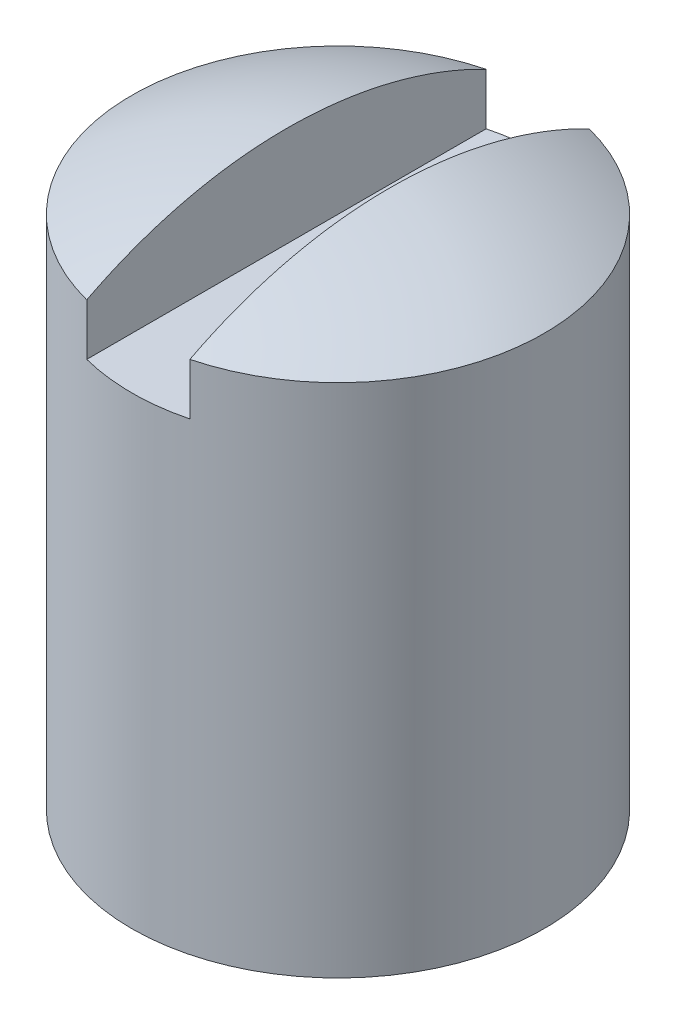
ISO-10303-21;
HEADER;
FILE_DESCRIPTION(('STEP AP214'),'2;1');
FILE_NAME('part.step','',(''),(''),'','','');
FILE_SCHEMA(('AUTOMOTIVE_DESIGN { 1 0 10303 214 1 1 1 1 }'));
ENDSEC;
DATA;
#1=APPLICATION_CONTEXT('core data for automotive mechanical design processes');
#2=APPLICATION_PROTOCOL_DEFINITION('international standard','automotive_design',2000,#1);
#3=PRODUCT_CONTEXT('',#1,'mechanical');
#4=PRODUCT('Part','Part','',(#3));
#5=PRODUCT_RELATED_PRODUCT_CATEGORY('part','',(#4));
#6=PRODUCT_DEFINITION_FORMATION('','',#4);
#7=PRODUCT_DEFINITION_CONTEXT('part definition',#1,'design');
#8=PRODUCT_DEFINITION('design','',#6,#7);
#9=PRODUCT_DEFINITION_SHAPE('','',#8);
#10=(LENGTH_UNIT() NAMED_UNIT(*) SI_UNIT(.MILLI.,.METRE.));
#11=(NAMED_UNIT(*) PLANE_ANGLE_UNIT() SI_UNIT($,.RADIAN.));
#12=(NAMED_UNIT(*) SI_UNIT($,.STERADIAN.) SOLID_ANGLE_UNIT());
#13=UNCERTAINTY_MEASURE_WITH_UNIT(LENGTH_MEASURE(1.E-05),#10,'distance_accuracy_value','');
#14=(GEOMETRIC_REPRESENTATION_CONTEXT(3) GLOBAL_UNCERTAINTY_ASSIGNED_CONTEXT((#13)) GLOBAL_UNIT_ASSIGNED_CONTEXT((#10,
#11,#12)) REPRESENTATION_CONTEXT('',''));
#15=CARTESIAN_POINT('',(0.,0.,0.));
#16=DIRECTION('',(0.,0.,1.));
#17=DIRECTION('',(1.,0.,0.));
#18=AXIS2_PLACEMENT_3D('',#15,#16,#17);
#19=CARTESIAN_POINT('',(0.,5.,0.));
#20=DIRECTION('',(0.,-1.,0.));
#21=DIRECTION('',(-1.,0.,0.));
#22=AXIS2_PLACEMENT_3D('',#19,#20,#21);
#23=SPHERICAL_SURFACE('',#22,8.5);
#24=CARTESIAN_POINT('',(0.,12.5,0.));
#25=DIRECTION('',(0.,-1.,0.));
#26=DIRECTION('',(0.,0.,-1.));
#27=AXIS2_PLACEMENT_3D('',#24,#25,#26);
#28=CIRCLE('',#27,4.);
#29=CARTESIAN_POINT('',(-0.999999999999999,12.5,3.87298334620742));
#30=VERTEX_POINT('',#29);
#31=CARTESIAN_POINT('',(-1.,12.5,-3.87298334620742));
#32=VERTEX_POINT('',#31);
#33=EDGE_CURVE('E87',#30,#32,#28,.T.);
#34=ORIENTED_EDGE('',*,*,#33,.F.);
#35=CARTESIAN_POINT('',(-0.999999999999999,5.,0.));
#36=DIRECTION('',(-1.,0.,0.));
#37=DIRECTION('',(0.,-1.,0.));
#38=AXIS2_PLACEMENT_3D('',#35,#36,#37);
#39=CIRCLE('',#38,8.44097150806707);
#40=EDGE_CURVE('E98',#30,#32,#39,.T.);
#41=ORIENTED_EDGE('',*,*,#40,.T.);
#42=EDGE_LOOP('',(#34,#41));
#43=FACE_BOUND('',#42,.T.);
#44=ADVANCED_FACE('F30',(#43),#23,.T.);
#45=CARTESIAN_POINT('',(0.999999999999999,12.5,-3.87298334620742));
#46=VERTEX_POINT('',#45);
#47=CARTESIAN_POINT('',(1.,12.5,3.87298334620742));
#48=VERTEX_POINT('',#47);
#49=EDGE_CURVE('E78',#46,#48,#28,.T.);
#50=ORIENTED_EDGE('',*,*,#49,.F.);
#51=CARTESIAN_POINT('',(0.999999999999999,5.,0.));
#52=DIRECTION('',(1.,0.,0.));
#53=DIRECTION('',(0.,1.,0.));
#54=AXIS2_PLACEMENT_3D('',#51,#52,#53);
#55=CIRCLE('',#54,8.44097150806707);
#56=EDGE_CURVE('E96',#46,#48,#55,.T.);
#57=ORIENTED_EDGE('',*,*,#56,.T.);
#58=EDGE_LOOP('',(#50,#57));
#59=FACE_BOUND('',#58,.T.);
#60=ADVANCED_FACE('F32',(#59),#23,.T.);
#61=CARTESIAN_POINT('',(0.,0.,0.));
#62=DIRECTION('',(0.,-1.,0.));
#63=DIRECTION('',(0.,0.,-1.));
#64=AXIS2_PLACEMENT_3D('',#61,#62,#63);
#65=CYLINDRICAL_SURFACE('',#64,4.);
#66=CARTESIAN_POINT('',(0.,11.5,0.));
#67=DIRECTION('',(0.,-1.,0.));
#68=DIRECTION('',(0.,0.,-1.));
#69=AXIS2_PLACEMENT_3D('',#66,#67,#68);
#70=CIRCLE('',#69,4.);
#71=CARTESIAN_POINT('',(1.,11.5,3.87298334620742));
#72=VERTEX_POINT('',#71);
#73=CARTESIAN_POINT('',(-1.,11.5,3.87298334620742));
#74=VERTEX_POINT('',#73);
#75=EDGE_CURVE('E80',#72,#74,#70,.T.);
#76=ORIENTED_EDGE('',*,*,#75,.T.);
#77=DIRECTION('',(0.,-1.,0.));
#78=VECTOR('',#77,1.);
#79=CARTESIAN_POINT('',(-0.999999999999999,0.,3.87298334620742));
#80=LINE('',#79,#78);
#81=EDGE_CURVE('E11',#74,#30,#80,.F.);
#82=ORIENTED_EDGE('',*,*,#81,.T.);
#83=ORIENTED_EDGE('',*,*,#33,.T.);
#84=DIRECTION('',(0.,-1.,0.));
#85=VECTOR('',#84,1.);
#86=CARTESIAN_POINT('',(-0.999999999999999,0.,-3.87298334620742));
#87=LINE('',#86,#85);
#88=CARTESIAN_POINT('',(-1.,11.5,-3.87298334620742));
#89=VERTEX_POINT('',#88);
#90=EDGE_CURVE('E53',#32,#89,#87,.T.);
#91=ORIENTED_EDGE('',*,*,#90,.T.);
#92=CARTESIAN_POINT('',(1.,11.5,-3.87298334620742));
#93=VERTEX_POINT('',#92);
#94=EDGE_CURVE('E71',#89,#93,#70,.T.);
#95=ORIENTED_EDGE('',*,*,#94,.T.);
#96=DIRECTION('',(0.,-1.,0.));
#97=VECTOR('',#96,1.);
#98=CARTESIAN_POINT('',(0.999999999999999,0.,-3.87298334620742));
#99=LINE('',#98,#97);
#100=EDGE_CURVE('E77',#93,#46,#99,.F.);
#101=ORIENTED_EDGE('',*,*,#100,.T.);
#102=ORIENTED_EDGE('',*,*,#49,.T.);
#103=DIRECTION('',(0.,-1.,0.));
#104=VECTOR('',#103,1.);
#105=CARTESIAN_POINT('',(0.999999999999999,0.,3.87298334620742));
#106=LINE('',#105,#104);
#107=EDGE_CURVE('E38',#48,#72,#106,.T.);
#108=ORIENTED_EDGE('',*,*,#107,.T.);
#109=EDGE_LOOP('',(#76,#82,#83,#91,#95,#101,#102,#108));
#110=FACE_BOUND('',#109,.T.);
#111=CARTESIAN_POINT('',(0.,2.5,0.));
#112=DIRECTION('',(0.,-1.,0.));
#113=DIRECTION('',(0.,0.,-1.));
#114=AXIS2_PLACEMENT_3D('',#111,#112,#113);
#115=CIRCLE('',#114,4.);
#116=CARTESIAN_POINT('',(0.,2.5,-4.));
#117=VERTEX_POINT('',#116);
#118=EDGE_CURVE('E106',#117,#117,#115,.T.);
#119=ORIENTED_EDGE('',*,*,#118,.F.);
#120=EDGE_LOOP('',(#119));
#121=FACE_BOUND('',#120,.T.);
#122=ADVANCED_FACE('F84',(#110,#121),#65,.T.);
#123=CARTESIAN_POINT('',(0.,2.5,0.));
#124=DIRECTION('',(0.,1.,0.));
#125=DIRECTION('',(0.,0.,1.));
#126=AXIS2_PLACEMENT_3D('',#123,#124,#125);
#127=CONICAL_SURFACE('',#126,4.,1.04719755119659);
#128=CARTESIAN_POINT('',(0.,1.25,0.));
#129=DIRECTION('',(0.,-1.,0.));
#130=DIRECTION('',(0.,0.,-1.));
#131=AXIS2_PLACEMENT_3D('',#128,#129,#130);
#132=CIRCLE('',#131,1.83493649053893);
#133=CARTESIAN_POINT('',(0.,1.25,-1.83493649053893));
#134=VERTEX_POINT('',#133);
#135=EDGE_CURVE('E100',#134,#134,#132,.T.);
#136=ORIENTED_EDGE('',*,*,#135,.F.);
#137=EDGE_LOOP('',(#136));
#138=FACE_BOUND('',#137,.T.);
#139=ORIENTED_EDGE('',*,*,#118,.T.);
#140=EDGE_LOOP('',(#139));
#141=FACE_BOUND('',#140,.T.);
#142=ADVANCED_FACE('F111',(#138,#141),#127,.T.);
#143=CARTESIAN_POINT('',(-1.83493649053893,1.25,0.));
#144=DIRECTION('',(0.,1.,0.));
#145=DIRECTION('',(0.,0.,1.));
#146=AXIS2_PLACEMENT_3D('',#143,#144,#145);
#147=PLANE('',#146);
#148=ORIENTED_EDGE('',*,*,#135,.T.);
#149=EDGE_LOOP('',(#148));
#150=FACE_BOUND('',#149,.T.);
#151=ADVANCED_FACE('F117',(#150),#147,.F.);
#152=CARTESIAN_POINT('',(-1.,13.9095467638668,-5.));
#153=DIRECTION('',(-1.,0.,0.));
#154=DIRECTION('',(0.,-1.,0.));
#155=AXIS2_PLACEMENT_3D('',#152,#153,#154);
#156=PLANE('',#155);
#157=ORIENTED_EDGE('',*,*,#40,.F.);
#158=ORIENTED_EDGE('',*,*,#81,.F.);
#159=DIRECTION('',(0.,0.,1.));
#160=VECTOR('',#159,1.);
#161=CARTESIAN_POINT('',(-1.,11.5,-5.));
#162=LINE('',#161,#160);
#163=EDGE_CURVE('E73',#89,#74,#162,.T.);
#164=ORIENTED_EDGE('',*,*,#163,.F.);
#165=ORIENTED_EDGE('',*,*,#90,.F.);
#166=EDGE_LOOP('',(#157,#158,#164,#165));
#167=FACE_BOUND('',#166,.T.);
#168=ADVANCED_FACE('F81',(#167),#156,.F.);
#169=CARTESIAN_POINT('',(1.,13.9095467638668,-5.));
#170=DIRECTION('',(1.,0.,0.));
#171=DIRECTION('',(0.,1.,0.));
#172=AXIS2_PLACEMENT_3D('',#169,#170,#171);
#173=PLANE('',#172);
#174=ORIENTED_EDGE('',*,*,#56,.F.);
#175=ORIENTED_EDGE('',*,*,#100,.F.);
#176=DIRECTION('',(0.,0.,1.));
#177=VECTOR('',#176,1.);
#178=CARTESIAN_POINT('',(1.,11.5,-5.));
#179=LINE('',#178,#177);
#180=EDGE_CURVE('E45',#93,#72,#179,.T.);
#181=ORIENTED_EDGE('',*,*,#180,.T.);
#182=ORIENTED_EDGE('',*,*,#107,.F.);
#183=EDGE_LOOP('',(#174,#175,#181,#182));
#184=FACE_BOUND('',#183,.T.);
#185=ADVANCED_FACE('F95',(#184),#173,.F.);
#186=CARTESIAN_POINT('',(-1.,11.5,-5.));
#187=DIRECTION('',(0.,-1.,0.));
#188=DIRECTION('',(0.,0.,-1.));
#189=AXIS2_PLACEMENT_3D('',#186,#187,#188);
#190=PLANE('',#189);
#191=ORIENTED_EDGE('',*,*,#180,.F.);
#192=ORIENTED_EDGE('',*,*,#94,.F.);
#193=ORIENTED_EDGE('',*,*,#163,.T.);
#194=ORIENTED_EDGE('',*,*,#75,.F.);
#195=EDGE_LOOP('',(#191,#192,#193,#194));
#196=FACE_BOUND('',#195,.T.);
#197=ADVANCED_FACE('F72',(#196),#190,.F.);
#198=CLOSED_SHELL('',(#44,#60,#122,#142,#151,#168,#185,#197));
#199=MANIFOLD_SOLID_BREP('B2',#198);
#200=ADVANCED_BREP_SHAPE_REPRESENTATION('',(#18,#199),#14);
#201=SHAPE_DEFINITION_REPRESENTATION(#9,#200);
ENDSEC;
END-ISO-10303-21;
